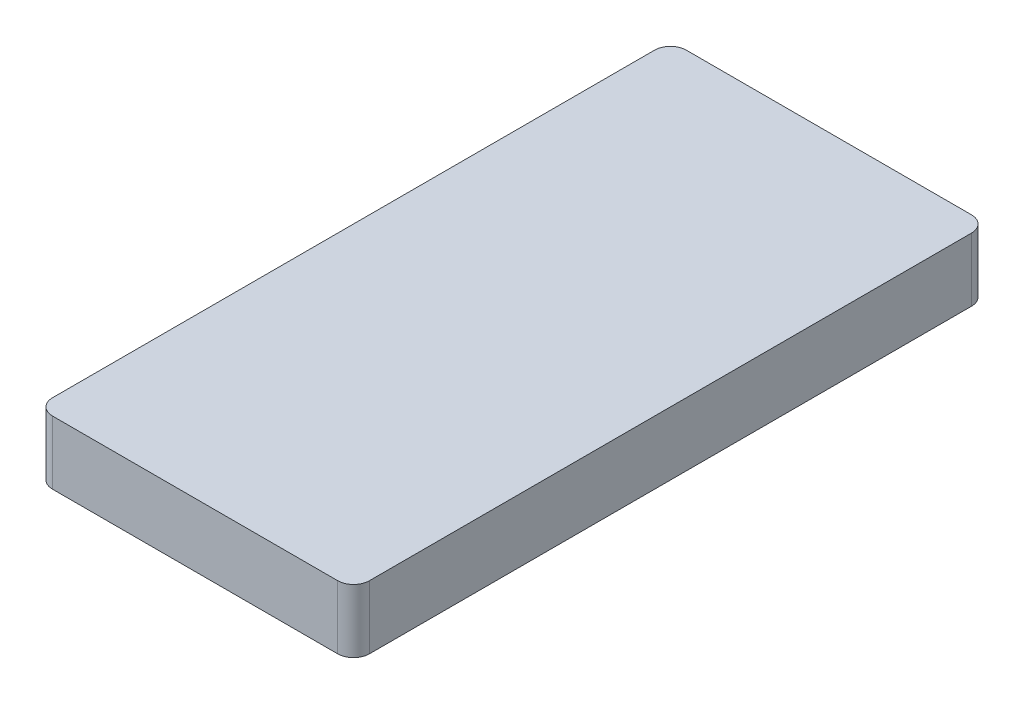
ISO-10303-21;
HEADER;
FILE_DESCRIPTION(('STEP AP214'),'2;1');
FILE_NAME('part.step','',(''),(''),'','','');
FILE_SCHEMA(('AUTOMOTIVE_DESIGN { 1 0 10303 214 1 1 1 1 }'));
ENDSEC;
DATA;
#1=APPLICATION_CONTEXT('core data for automotive mechanical design processes');
#2=APPLICATION_PROTOCOL_DEFINITION('international standard','automotive_design',2000,#1);
#3=PRODUCT_CONTEXT('',#1,'mechanical');
#4=PRODUCT('Part','Part','',(#3));
#5=PRODUCT_RELATED_PRODUCT_CATEGORY('part','',(#4));
#6=PRODUCT_DEFINITION_FORMATION('','',#4);
#7=PRODUCT_DEFINITION_CONTEXT('part definition',#1,'design');
#8=PRODUCT_DEFINITION('design','',#6,#7);
#9=PRODUCT_DEFINITION_SHAPE('','',#8);
#10=(LENGTH_UNIT() NAMED_UNIT(*) SI_UNIT(.MILLI.,.METRE.));
#11=(NAMED_UNIT(*) PLANE_ANGLE_UNIT() SI_UNIT($,.RADIAN.));
#12=(NAMED_UNIT(*) SI_UNIT($,.STERADIAN.) SOLID_ANGLE_UNIT());
#13=UNCERTAINTY_MEASURE_WITH_UNIT(LENGTH_MEASURE(1.E-05),#10,'distance_accuracy_value','');
#14=(GEOMETRIC_REPRESENTATION_CONTEXT(3) GLOBAL_UNCERTAINTY_ASSIGNED_CONTEXT((#13)) GLOBAL_UNIT_ASSIGNED_CONTEXT((#10,
#11,#12)) REPRESENTATION_CONTEXT('',''));
#15=CARTESIAN_POINT('',(0.,0.,0.));
#16=DIRECTION('',(0.,0.,1.));
#17=DIRECTION('',(1.,0.,0.));
#18=AXIS2_PLACEMENT_3D('',#15,#16,#17);
#19=CARTESIAN_POINT('',(5.,2.,10.));
#20=DIRECTION('',(-1.,0.,0.));
#21=DIRECTION('',(0.,0.,1.));
#22=AXIS2_PLACEMENT_3D('',#19,#20,#21);
#23=PLANE('',#22);
#24=DIRECTION('',(0.,0.,-1.));
#25=VECTOR('',#24,1.);
#26=CARTESIAN_POINT('',(5.,0.,10.));
#27=LINE('',#26,#25);
#28=CARTESIAN_POINT('',(5.,0.,9.5));
#29=VERTEX_POINT('',#28);
#30=CARTESIAN_POINT('',(5.,0.,-9.5));
#31=VERTEX_POINT('',#30);
#32=EDGE_CURVE('E130',#29,#31,#27,.T.);
#33=ORIENTED_EDGE('',*,*,#32,.T.);
#34=DIRECTION('',(0.,-1.,0.));
#35=VECTOR('',#34,1.);
#36=CARTESIAN_POINT('',(5.,2.,-9.5));
#37=LINE('',#36,#35);
#38=CARTESIAN_POINT('',(5.,2.,-9.5));
#39=VERTEX_POINT('',#38);
#40=EDGE_CURVE('E152',#31,#39,#37,.F.);
#41=ORIENTED_EDGE('',*,*,#40,.T.);
#42=DIRECTION('',(0.,0.,-1.));
#43=VECTOR('',#42,1.);
#44=CARTESIAN_POINT('',(5.,2.,10.));
#45=LINE('',#44,#43);
#46=CARTESIAN_POINT('',(5.,2.,9.5));
#47=VERTEX_POINT('',#46);
#48=EDGE_CURVE('E128',#47,#39,#45,.T.);
#49=ORIENTED_EDGE('',*,*,#48,.F.);
#50=DIRECTION('',(0.,-1.,0.));
#51=VECTOR('',#50,1.);
#52=CARTESIAN_POINT('',(5.,2.,9.5));
#53=LINE('',#52,#51);
#54=EDGE_CURVE('E149',#47,#29,#53,.T.);
#55=ORIENTED_EDGE('',*,*,#54,.T.);
#56=EDGE_LOOP('',(#33,#41,#49,#55));
#57=FACE_BOUND('',#56,.T.);
#58=ADVANCED_FACE('F33',(#57),#23,.F.);
#59=CARTESIAN_POINT('',(-5.,2.,-10.));
#60=DIRECTION('',(0.,0.,1.));
#61=DIRECTION('',(1.,0.,0.));
#62=AXIS2_PLACEMENT_3D('',#59,#60,#61);
#63=PLANE('',#62);
#64=DIRECTION('',(-1.,0.,0.));
#65=VECTOR('',#64,1.);
#66=CARTESIAN_POINT('',(-5.,0.,-10.));
#67=LINE('',#66,#65);
#68=CARTESIAN_POINT('',(4.5,0.,-10.));
#69=VERTEX_POINT('',#68);
#70=CARTESIAN_POINT('',(-4.5,0.,-10.));
#71=VERTEX_POINT('',#70);
#72=EDGE_CURVE('E126',#69,#71,#67,.T.);
#73=ORIENTED_EDGE('',*,*,#72,.T.);
#74=DIRECTION('',(0.,-1.,0.));
#75=VECTOR('',#74,1.);
#76=CARTESIAN_POINT('',(-4.5,2.,-10.));
#77=LINE('',#76,#75);
#78=CARTESIAN_POINT('',(-4.5,2.,-10.));
#79=VERTEX_POINT('',#78);
#80=EDGE_CURVE('E104',#71,#79,#77,.F.);
#81=ORIENTED_EDGE('',*,*,#80,.T.);
#82=DIRECTION('',(-1.,0.,0.));
#83=VECTOR('',#82,1.);
#84=CARTESIAN_POINT('',(-5.,2.,-10.));
#85=LINE('',#84,#83);
#86=CARTESIAN_POINT('',(4.5,2.,-10.));
#87=VERTEX_POINT('',#86);
#88=EDGE_CURVE('E166',#87,#79,#85,.T.);
#89=ORIENTED_EDGE('',*,*,#88,.F.);
#90=DIRECTION('',(0.,-1.,0.));
#91=VECTOR('',#90,1.);
#92=CARTESIAN_POINT('',(4.5,2.,-10.));
#93=LINE('',#92,#91);
#94=EDGE_CURVE('E109',#87,#69,#93,.T.);
#95=ORIENTED_EDGE('',*,*,#94,.T.);
#96=EDGE_LOOP('',(#73,#81,#89,#95));
#97=FACE_BOUND('',#96,.T.);
#98=ADVANCED_FACE('F171',(#97),#63,.F.);
#99=CARTESIAN_POINT('',(-5.,2.,10.));
#100=DIRECTION('',(1.,0.,0.));
#101=DIRECTION('',(0.,0.,-1.));
#102=AXIS2_PLACEMENT_3D('',#99,#100,#101);
#103=PLANE('',#102);
#104=DIRECTION('',(0.,0.,1.));
#105=VECTOR('',#104,1.);
#106=CARTESIAN_POINT('',(-5.,2.,10.));
#107=LINE('',#106,#105);
#108=CARTESIAN_POINT('',(-5.,2.,-9.5));
#109=VERTEX_POINT('',#108);
#110=CARTESIAN_POINT('',(-5.,2.,9.5));
#111=VERTEX_POINT('',#110);
#112=EDGE_CURVE('E118',#109,#111,#107,.T.);
#113=ORIENTED_EDGE('',*,*,#112,.F.);
#114=DIRECTION('',(0.,-1.,0.));
#115=VECTOR('',#114,1.);
#116=CARTESIAN_POINT('',(-5.,2.,-9.5));
#117=LINE('',#116,#115);
#118=CARTESIAN_POINT('',(-5.,0.,-9.5));
#119=VERTEX_POINT('',#118);
#120=EDGE_CURVE('E103',#109,#119,#117,.T.);
#121=ORIENTED_EDGE('',*,*,#120,.T.);
#122=DIRECTION('',(0.,0.,1.));
#123=VECTOR('',#122,1.);
#124=CARTESIAN_POINT('',(-5.,0.,10.));
#125=LINE('',#124,#123);
#126=CARTESIAN_POINT('',(-5.,0.,9.5));
#127=VERTEX_POINT('',#126);
#128=EDGE_CURVE('E116',#119,#127,#125,.T.);
#129=ORIENTED_EDGE('',*,*,#128,.T.);
#130=DIRECTION('',(0.,-1.,0.));
#131=VECTOR('',#130,1.);
#132=CARTESIAN_POINT('',(-5.,2.,9.5));
#133=LINE('',#132,#131);
#134=EDGE_CURVE('E120',#127,#111,#133,.F.);
#135=ORIENTED_EDGE('',*,*,#134,.T.);
#136=EDGE_LOOP('',(#113,#121,#129,#135));
#137=FACE_BOUND('',#136,.T.);
#138=ADVANCED_FACE('F115',(#137),#103,.F.);
#139=CARTESIAN_POINT('',(-5.,2.,10.));
#140=DIRECTION('',(0.,0.,-1.));
#141=DIRECTION('',(-1.,0.,0.));
#142=AXIS2_PLACEMENT_3D('',#139,#140,#141);
#143=PLANE('',#142);
#144=DIRECTION('',(1.,0.,0.));
#145=VECTOR('',#144,1.);
#146=CARTESIAN_POINT('',(-5.,2.,10.));
#147=LINE('',#146,#145);
#148=CARTESIAN_POINT('',(-4.5,2.,10.));
#149=VERTEX_POINT('',#148);
#150=CARTESIAN_POINT('',(4.5,2.,10.));
#151=VERTEX_POINT('',#150);
#152=EDGE_CURVE('E134',#149,#151,#147,.T.);
#153=ORIENTED_EDGE('',*,*,#152,.F.);
#154=DIRECTION('',(0.,-1.,0.));
#155=VECTOR('',#154,1.);
#156=CARTESIAN_POINT('',(-4.5,2.,10.));
#157=LINE('',#156,#155);
#158=CARTESIAN_POINT('',(-4.5,0.,10.));
#159=VERTEX_POINT('',#158);
#160=EDGE_CURVE('E11',#149,#159,#157,.T.);
#161=ORIENTED_EDGE('',*,*,#160,.T.);
#162=DIRECTION('',(1.,0.,0.));
#163=VECTOR('',#162,1.);
#164=CARTESIAN_POINT('',(-5.,0.,10.));
#165=LINE('',#164,#163);
#166=CARTESIAN_POINT('',(4.5,0.,10.));
#167=VERTEX_POINT('',#166);
#168=EDGE_CURVE('E125',#159,#167,#165,.T.);
#169=ORIENTED_EDGE('',*,*,#168,.T.);
#170=DIRECTION('',(0.,-1.,0.));
#171=VECTOR('',#170,1.);
#172=CARTESIAN_POINT('',(4.5,2.,10.));
#173=LINE('',#172,#171);
#174=EDGE_CURVE('E41',#167,#151,#173,.F.);
#175=ORIENTED_EDGE('',*,*,#174,.T.);
#176=EDGE_LOOP('',(#153,#161,#169,#175));
#177=FACE_BOUND('',#176,.T.);
#178=ADVANCED_FACE('F178',(#177),#143,.F.);
#179=CARTESIAN_POINT('',(0.,2.,0.));
#180=DIRECTION('',(0.,-1.,0.));
#181=DIRECTION('',(0.,0.,-1.));
#182=AXIS2_PLACEMENT_3D('',#179,#180,#181);
#183=PLANE('',#182);
#184=ORIENTED_EDGE('',*,*,#88,.T.);
#185=CARTESIAN_POINT('',(-4.5,2.,-9.5));
#186=DIRECTION('',(0.,-1.,0.));
#187=DIRECTION('',(0.,0.,-1.));
#188=AXIS2_PLACEMENT_3D('',#185,#186,#187);
#189=CIRCLE('',#188,0.5);
#190=EDGE_CURVE('E147',#79,#109,#189,.F.);
#191=ORIENTED_EDGE('',*,*,#190,.T.);
#192=ORIENTED_EDGE('',*,*,#112,.T.);
#193=CARTESIAN_POINT('',(-4.5,2.,9.5));
#194=DIRECTION('',(0.,-1.,0.));
#195=DIRECTION('',(0.,0.,-1.));
#196=AXIS2_PLACEMENT_3D('',#193,#194,#195);
#197=CIRCLE('',#196,0.5);
#198=EDGE_CURVE('E54',#111,#149,#197,.F.);
#199=ORIENTED_EDGE('',*,*,#198,.T.);
#200=ORIENTED_EDGE('',*,*,#152,.T.);
#201=CARTESIAN_POINT('',(4.5,2.,9.5));
#202=DIRECTION('',(0.,-1.,0.));
#203=DIRECTION('',(0.,0.,-1.));
#204=AXIS2_PLACEMENT_3D('',#201,#202,#203);
#205=CIRCLE('',#204,0.5);
#206=EDGE_CURVE('E142',#151,#47,#205,.F.);
#207=ORIENTED_EDGE('',*,*,#206,.T.);
#208=ORIENTED_EDGE('',*,*,#48,.T.);
#209=CARTESIAN_POINT('',(4.5,2.,-9.5));
#210=DIRECTION('',(0.,-1.,0.));
#211=DIRECTION('',(0.,0.,-1.));
#212=AXIS2_PLACEMENT_3D('',#209,#210,#211);
#213=CIRCLE('',#212,0.5);
#214=EDGE_CURVE('E145',#39,#87,#213,.F.);
#215=ORIENTED_EDGE('',*,*,#214,.T.);
#216=EDGE_LOOP('',(#184,#191,#192,#199,#200,#207,#208,#215));
#217=FACE_BOUND('',#216,.T.);
#218=ADVANCED_FACE('F163',(#217),#183,.F.);
#219=CARTESIAN_POINT('',(0.,0.,0.));
#220=DIRECTION('',(0.,-1.,0.));
#221=DIRECTION('',(0.,0.,-1.));
#222=AXIS2_PLACEMENT_3D('',#219,#220,#221);
#223=PLANE('',#222);
#224=ORIENTED_EDGE('',*,*,#128,.F.);
#225=CARTESIAN_POINT('',(-4.5,0.,-9.5));
#226=DIRECTION('',(0.,-1.,0.));
#227=DIRECTION('',(0.,0.,-1.));
#228=AXIS2_PLACEMENT_3D('',#225,#226,#227);
#229=CIRCLE('',#228,0.5);
#230=EDGE_CURVE('E99',#119,#71,#229,.T.);
#231=ORIENTED_EDGE('',*,*,#230,.T.);
#232=ORIENTED_EDGE('',*,*,#72,.F.);
#233=CARTESIAN_POINT('',(4.5,0.,-9.5));
#234=DIRECTION('',(0.,-1.,0.));
#235=DIRECTION('',(0.,0.,-1.));
#236=AXIS2_PLACEMENT_3D('',#233,#234,#235);
#237=CIRCLE('',#236,0.5);
#238=EDGE_CURVE('E110',#69,#31,#237,.T.);
#239=ORIENTED_EDGE('',*,*,#238,.T.);
#240=ORIENTED_EDGE('',*,*,#32,.F.);
#241=CARTESIAN_POINT('',(4.5,0.,9.5));
#242=DIRECTION('',(0.,-1.,0.));
#243=DIRECTION('',(0.,0.,-1.));
#244=AXIS2_PLACEMENT_3D('',#241,#242,#243);
#245=CIRCLE('',#244,0.5);
#246=EDGE_CURVE('E119',#29,#167,#245,.T.);
#247=ORIENTED_EDGE('',*,*,#246,.T.);
#248=ORIENTED_EDGE('',*,*,#168,.F.);
#249=CARTESIAN_POINT('',(-4.5,0.,9.5));
#250=DIRECTION('',(0.,-1.,0.));
#251=DIRECTION('',(0.,0.,-1.));
#252=AXIS2_PLACEMENT_3D('',#249,#250,#251);
#253=CIRCLE('',#252,0.5);
#254=EDGE_CURVE('E124',#159,#127,#253,.T.);
#255=ORIENTED_EDGE('',*,*,#254,.T.);
#256=EDGE_LOOP('',(#224,#231,#232,#239,#240,#247,#248,#255));
#257=FACE_BOUND('',#256,.T.);
#258=ADVANCED_FACE('F122',(#257),#223,.T.);
#259=CARTESIAN_POINT('',(-4.5,2.,-9.5));
#260=DIRECTION('',(0.,-1.,0.));
#261=DIRECTION('',(0.,0.,-1.));
#262=AXIS2_PLACEMENT_3D('',#259,#260,#261);
#263=CYLINDRICAL_SURFACE('',#262,0.5);
#264=ORIENTED_EDGE('',*,*,#190,.F.);
#265=ORIENTED_EDGE('',*,*,#80,.F.);
#266=ORIENTED_EDGE('',*,*,#230,.F.);
#267=ORIENTED_EDGE('',*,*,#120,.F.);
#268=EDGE_LOOP('',(#264,#265,#266,#267));
#269=FACE_BOUND('',#268,.T.);
#270=ADVANCED_FACE('F102',(#269),#263,.T.);
#271=CARTESIAN_POINT('',(4.5,2.,-9.5));
#272=DIRECTION('',(0.,-1.,0.));
#273=DIRECTION('',(0.,0.,-1.));
#274=AXIS2_PLACEMENT_3D('',#271,#272,#273);
#275=CYLINDRICAL_SURFACE('',#274,0.5);
#276=ORIENTED_EDGE('',*,*,#214,.F.);
#277=ORIENTED_EDGE('',*,*,#40,.F.);
#278=ORIENTED_EDGE('',*,*,#238,.F.);
#279=ORIENTED_EDGE('',*,*,#94,.F.);
#280=EDGE_LOOP('',(#276,#277,#278,#279));
#281=FACE_BOUND('',#280,.T.);
#282=ADVANCED_FACE('F169',(#281),#275,.T.);
#283=CARTESIAN_POINT('',(-4.5,2.,9.5));
#284=DIRECTION('',(0.,-1.,0.));
#285=DIRECTION('',(0.,0.,-1.));
#286=AXIS2_PLACEMENT_3D('',#283,#284,#285);
#287=CYLINDRICAL_SURFACE('',#286,0.5);
#288=ORIENTED_EDGE('',*,*,#198,.F.);
#289=ORIENTED_EDGE('',*,*,#134,.F.);
#290=ORIENTED_EDGE('',*,*,#254,.F.);
#291=ORIENTED_EDGE('',*,*,#160,.F.);
#292=EDGE_LOOP('',(#288,#289,#290,#291));
#293=FACE_BOUND('',#292,.T.);
#294=ADVANCED_FACE('F177',(#293),#287,.T.);
#295=CARTESIAN_POINT('',(4.5,2.,9.5));
#296=DIRECTION('',(0.,-1.,0.));
#297=DIRECTION('',(0.,0.,-1.));
#298=AXIS2_PLACEMENT_3D('',#295,#296,#297);
#299=CYLINDRICAL_SURFACE('',#298,0.5);
#300=ORIENTED_EDGE('',*,*,#206,.F.);
#301=ORIENTED_EDGE('',*,*,#174,.F.);
#302=ORIENTED_EDGE('',*,*,#246,.F.);
#303=ORIENTED_EDGE('',*,*,#54,.F.);
#304=EDGE_LOOP('',(#300,#301,#302,#303));
#305=FACE_BOUND('',#304,.T.);
#306=ADVANCED_FACE('F35',(#305),#299,.T.);
#307=CLOSED_SHELL('',(#58,#98,#138,#178,#218,#258,#270,#282,#294,#306));
#308=MANIFOLD_SOLID_BREP('B2',#307);
#309=ADVANCED_BREP_SHAPE_REPRESENTATION('',(#18,#308),#14);
#310=SHAPE_DEFINITION_REPRESENTATION(#9,#309);
ENDSEC;
END-ISO-10303-21;
